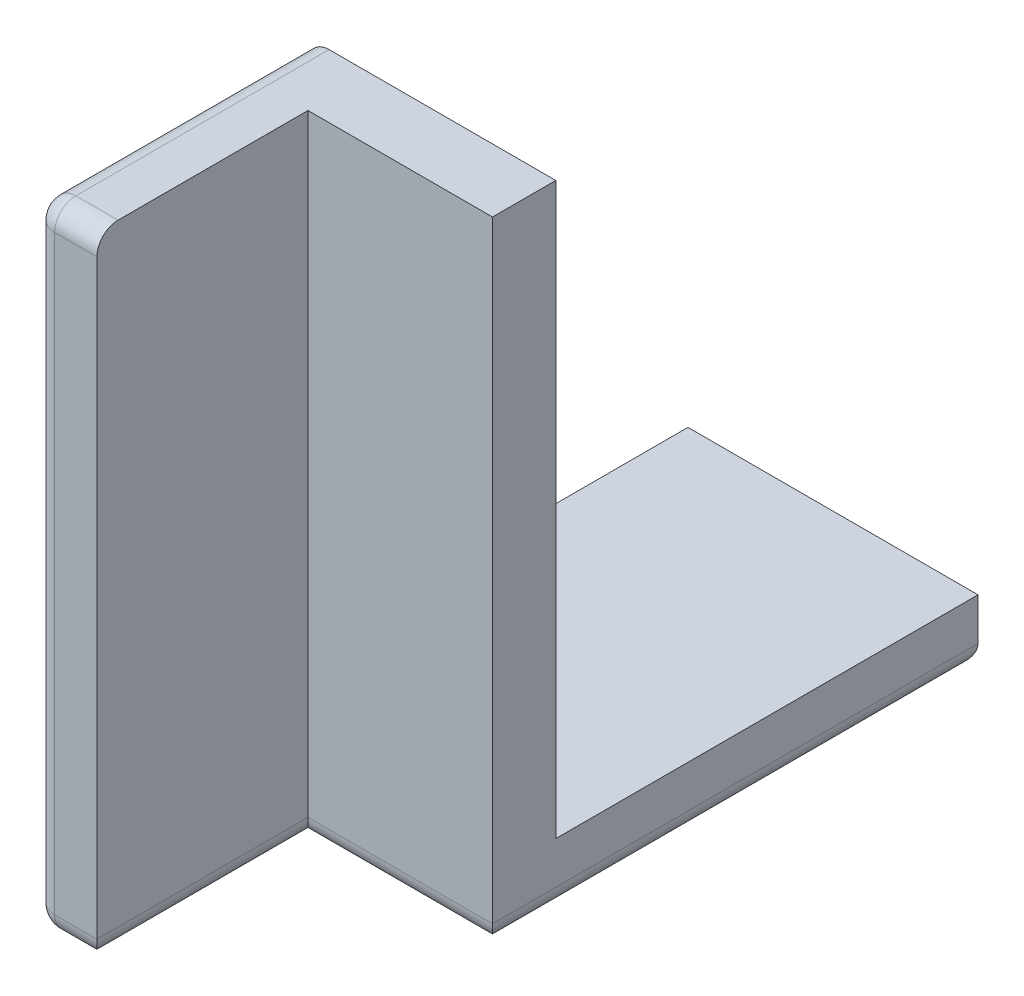
ISO-10303-21;
HEADER;
FILE_DESCRIPTION(('STEP AP214'),'2;1');
FILE_NAME('part.step','',(''),(''),'','','');
FILE_SCHEMA(('AUTOMOTIVE_DESIGN { 1 0 10303 214 1 1 1 1 }'));
ENDSEC;
DATA;
#1=APPLICATION_CONTEXT('core data for automotive mechanical design processes');
#2=APPLICATION_PROTOCOL_DEFINITION('international standard','automotive_design',2000,#1);
#3=PRODUCT_CONTEXT('',#1,'mechanical');
#4=PRODUCT('Part','Part','',(#3));
#5=PRODUCT_RELATED_PRODUCT_CATEGORY('part','',(#4));
#6=PRODUCT_DEFINITION_FORMATION('','',#4);
#7=PRODUCT_DEFINITION_CONTEXT('part definition',#1,'design');
#8=PRODUCT_DEFINITION('design','',#6,#7);
#9=PRODUCT_DEFINITION_SHAPE('','',#8);
#10=(LENGTH_UNIT() NAMED_UNIT(*) SI_UNIT(.MILLI.,.METRE.));
#11=(NAMED_UNIT(*) PLANE_ANGLE_UNIT() SI_UNIT($,.RADIAN.));
#12=(NAMED_UNIT(*) SI_UNIT($,.STERADIAN.) SOLID_ANGLE_UNIT());
#13=UNCERTAINTY_MEASURE_WITH_UNIT(LENGTH_MEASURE(1.E-05),#10,'distance_accuracy_value','');
#14=(GEOMETRIC_REPRESENTATION_CONTEXT(3) GLOBAL_UNCERTAINTY_ASSIGNED_CONTEXT((#13)) GLOBAL_UNIT_ASSIGNED_CONTEXT((#10,
#11,#12)) REPRESENTATION_CONTEXT('',''));
#15=CARTESIAN_POINT('',(0.,0.,0.));
#16=DIRECTION('',(0.,0.,1.));
#17=DIRECTION('',(1.,0.,0.));
#18=AXIS2_PLACEMENT_3D('',#15,#16,#17);
#19=CARTESIAN_POINT('',(0.,0.,0.));
#20=DIRECTION('',(0.,0.,1.));
#21=DIRECTION('',(1.,0.,0.));
#22=AXIS2_PLACEMENT_3D('',#19,#20,#21);
#23=PLANE('',#22);
#24=DIRECTION('',(0.,-1.,0.));
#25=VECTOR('',#24,1.);
#26=CARTESIAN_POINT('',(-3.,0.,0.));
#27=LINE('',#26,#25);
#28=CARTESIAN_POINT('',(-3.,-1.,0.));
#29=VERTEX_POINT('',#28);
#30=CARTESIAN_POINT('',(-3.,-27.,0.));
#31=VERTEX_POINT('',#30);
#32=EDGE_CURVE('E162',#29,#31,#27,.T.);
#33=ORIENTED_EDGE('',*,*,#32,.F.);
#34=CARTESIAN_POINT('',(-2.,-1.,0.));
#35=DIRECTION('',(0.,0.,1.));
#36=DIRECTION('',(1.,0.,0.));
#37=AXIS2_PLACEMENT_3D('',#34,#35,#36);
#38=CIRCLE('',#37,1.);
#39=CARTESIAN_POINT('',(-2.,0.,0.));
#40=VERTEX_POINT('',#39);
#41=EDGE_CURVE('E42',#29,#40,#38,.F.);
#42=ORIENTED_EDGE('',*,*,#41,.T.);
#43=DIRECTION('',(-1.,0.,0.));
#44=VECTOR('',#43,1.);
#45=CARTESIAN_POINT('',(8.74,0.,0.));
#46=LINE('',#45,#44);
#47=CARTESIAN_POINT('',(8.74,0.,0.));
#48=VERTEX_POINT('',#47);
#49=EDGE_CURVE('E182',#48,#40,#46,.T.);
#50=ORIENTED_EDGE('',*,*,#49,.F.);
#51=DIRECTION('',(0.,1.,0.));
#52=VECTOR('',#51,1.);
#53=CARTESIAN_POINT('',(8.74,-30.,0.));
#54=LINE('',#53,#52);
#55=CARTESIAN_POINT('',(8.74,-27.,0.));
#56=VERTEX_POINT('',#55);
#57=EDGE_CURVE('E186',#56,#48,#54,.T.);
#58=ORIENTED_EDGE('',*,*,#57,.F.);
#59=DIRECTION('',(1.,0.,0.));
#60=VECTOR('',#59,1.);
#61=CARTESIAN_POINT('',(0.,-27.,0.));
#62=LINE('',#61,#60);
#63=EDGE_CURVE('E323',#31,#56,#62,.T.);
#64=ORIENTED_EDGE('',*,*,#63,.F.);
#65=EDGE_LOOP('',(#33,#42,#50,#58,#64));
#66=FACE_BOUND('',#65,.T.);
#67=ADVANCED_FACE('F33',(#66),#23,.F.);
#68=CARTESIAN_POINT('',(0.,-30.,3.));
#69=DIRECTION('',(0.,1.,0.));
#70=DIRECTION('',(0.,0.,1.));
#71=AXIS2_PLACEMENT_3D('',#68,#69,#70);
#72=PLANE('',#71);
#73=DIRECTION('',(-1.,0.,0.));
#74=VECTOR('',#73,1.);
#75=CARTESIAN_POINT('',(8.74,-30.,-19.));
#76=LINE('',#75,#74);
#77=CARTESIAN_POINT('',(-4.,-30.,-19.));
#78=VERTEX_POINT('',#77);
#79=CARTESIAN_POINT('',(7.74,-30.,-19.));
#80=VERTEX_POINT('',#79);
#81=EDGE_CURVE('E207',#78,#80,#76,.F.);
#82=ORIENTED_EDGE('',*,*,#81,.T.);
#83=DIRECTION('',(0.,0.,-1.));
#84=VECTOR('',#83,1.);
#85=CARTESIAN_POINT('',(7.74,-30.,3.));
#86=LINE('',#85,#84);
#87=CARTESIAN_POINT('',(7.74,-30.,2.));
#88=VERTEX_POINT('',#87);
#89=EDGE_CURVE('E209',#80,#88,#86,.F.);
#90=ORIENTED_EDGE('',*,*,#89,.T.);
#91=DIRECTION('',(1.,0.,0.));
#92=VECTOR('',#91,1.);
#93=CARTESIAN_POINT('',(0.,-30.,2.));
#94=LINE('',#93,#92);
#95=CARTESIAN_POINT('',(-1.,-30.,2.));
#96=VERTEX_POINT('',#95);
#97=EDGE_CURVE('E195',#88,#96,#94,.F.);
#98=ORIENTED_EDGE('',*,*,#97,.T.);
#99=DIRECTION('',(0.,0.,-1.));
#100=VECTOR('',#99,1.);
#101=CARTESIAN_POINT('',(-1.,-30.,3.));
#102=LINE('',#101,#100);
#103=CARTESIAN_POINT('',(-1.,-30.,12.));
#104=VERTEX_POINT('',#103);
#105=EDGE_CURVE('E197',#96,#104,#102,.F.);
#106=ORIENTED_EDGE('',*,*,#105,.T.);
#107=DIRECTION('',(1.,0.,0.));
#108=VECTOR('',#107,1.);
#109=CARTESIAN_POINT('',(-3.,-30.,12.));
#110=LINE('',#109,#108);
#111=CARTESIAN_POINT('',(-2.,-30.,12.));
#112=VERTEX_POINT('',#111);
#113=EDGE_CURVE('E199',#104,#112,#110,.F.);
#114=ORIENTED_EDGE('',*,*,#113,.T.);
#115=DIRECTION('',(0.,0.,1.));
#116=VECTOR('',#115,1.);
#117=CARTESIAN_POINT('',(-2.,-30.,0.));
#118=LINE('',#117,#116);
#119=CARTESIAN_POINT('',(-2.,-30.,-1.));
#120=VERTEX_POINT('',#119);
#121=EDGE_CURVE('E201',#112,#120,#118,.F.);
#122=ORIENTED_EDGE('',*,*,#121,.T.);
#123=DIRECTION('',(1.,0.,0.));
#124=VECTOR('',#123,1.);
#125=CARTESIAN_POINT('',(0.,-30.,-1.));
#126=LINE('',#125,#124);
#127=CARTESIAN_POINT('',(-4.,-30.,-1.));
#128=VERTEX_POINT('',#127);
#129=EDGE_CURVE('E203',#120,#128,#126,.F.);
#130=ORIENTED_EDGE('',*,*,#129,.T.);
#131=DIRECTION('',(0.,0.,1.));
#132=VECTOR('',#131,1.);
#133=CARTESIAN_POINT('',(-4.,-30.,3.));
#134=LINE('',#133,#132);
#135=EDGE_CURVE('E205',#128,#78,#134,.F.);
#136=ORIENTED_EDGE('',*,*,#135,.T.);
#137=EDGE_LOOP('',(#82,#90,#98,#106,#114,#122,#130,#136));
#138=FACE_BOUND('',#137,.T.);
#139=ADVANCED_FACE('F355',(#138),#72,.F.);
#140=CARTESIAN_POINT('',(8.74,-30.,3.));
#141=DIRECTION('',(-1.,0.,0.));
#142=DIRECTION('',(0.,0.,1.));
#143=AXIS2_PLACEMENT_3D('',#140,#141,#142);
#144=PLANE('',#143);
#145=DIRECTION('',(0.,1.,0.));
#146=VECTOR('',#145,1.);
#147=CARTESIAN_POINT('',(8.74,-30.,3.));
#148=LINE('',#147,#146);
#149=CARTESIAN_POINT('',(8.74,-29.,3.));
#150=VERTEX_POINT('',#149);
#151=CARTESIAN_POINT('',(8.74,0.,3.));
#152=VERTEX_POINT('',#151);
#153=EDGE_CURVE('E176',#150,#152,#148,.T.);
#154=ORIENTED_EDGE('',*,*,#153,.F.);
#155=DIRECTION('',(0.,0.,-1.));
#156=VECTOR('',#155,1.);
#157=CARTESIAN_POINT('',(8.74,-29.,3.));
#158=LINE('',#157,#156);
#159=CARTESIAN_POINT('',(8.74,-29.,-20.));
#160=VERTEX_POINT('',#159);
#161=EDGE_CURVE('E192',#150,#160,#158,.T.);
#162=ORIENTED_EDGE('',*,*,#161,.T.);
#163=DIRECTION('',(0.,-1.,0.));
#164=VECTOR('',#163,1.);
#165=CARTESIAN_POINT('',(8.74,-27.,-20.));
#166=LINE('',#165,#164);
#167=CARTESIAN_POINT('',(8.74,-27.,-20.));
#168=VERTEX_POINT('',#167);
#169=EDGE_CURVE('E332',#168,#160,#166,.T.);
#170=ORIENTED_EDGE('',*,*,#169,.F.);
#171=DIRECTION('',(0.,0.,1.));
#172=VECTOR('',#171,1.);
#173=CARTESIAN_POINT('',(8.74,-27.,-20.));
#174=LINE('',#173,#172);
#175=EDGE_CURVE('E188',#168,#56,#174,.T.);
#176=ORIENTED_EDGE('',*,*,#175,.T.);
#177=ORIENTED_EDGE('',*,*,#57,.T.);
#178=DIRECTION('',(0.,0.,-1.));
#179=VECTOR('',#178,1.);
#180=CARTESIAN_POINT('',(8.74,0.,3.));
#181=LINE('',#180,#179);
#182=EDGE_CURVE('E178',#152,#48,#181,.T.);
#183=ORIENTED_EDGE('',*,*,#182,.F.);
#184=EDGE_LOOP('',(#154,#162,#170,#176,#177,#183));
#185=FACE_BOUND('',#184,.T.);
#186=ADVANCED_FACE('F317',(#185),#144,.F.);
#187=CARTESIAN_POINT('',(8.74,0.,3.));
#188=DIRECTION('',(0.,-1.,0.));
#189=DIRECTION('',(1.,0.,0.));
#190=AXIS2_PLACEMENT_3D('',#187,#188,#189);
#191=PLANE('',#190);
#192=DIRECTION('',(0.,0.,-1.));
#193=VECTOR('',#192,1.);
#194=CARTESIAN_POINT('',(-2.,0.,13.));
#195=LINE('',#194,#193);
#196=CARTESIAN_POINT('',(-2.,0.,12.));
#197=VERTEX_POINT('',#196);
#198=EDGE_CURVE('E50',#40,#197,#195,.F.);
#199=ORIENTED_EDGE('',*,*,#198,.T.);
#200=DIRECTION('',(-1.,0.,0.));
#201=VECTOR('',#200,1.);
#202=CARTESIAN_POINT('',(0.,0.,12.));
#203=LINE('',#202,#201);
#204=CARTESIAN_POINT('',(0.,0.,12.));
#205=VERTEX_POINT('',#204);
#206=EDGE_CURVE('E159',#197,#205,#203,.F.);
#207=ORIENTED_EDGE('',*,*,#206,.T.);
#208=DIRECTION('',(0.,0.,-1.));
#209=VECTOR('',#208,1.);
#210=CARTESIAN_POINT('',(0.,0.,13.));
#211=LINE('',#210,#209);
#212=CARTESIAN_POINT('',(0.,0.,3.));
#213=VERTEX_POINT('',#212);
#214=EDGE_CURVE('E153',#205,#213,#211,.T.);
#215=ORIENTED_EDGE('',*,*,#214,.T.);
#216=DIRECTION('',(-1.,0.,0.));
#217=VECTOR('',#216,1.);
#218=CARTESIAN_POINT('',(8.74,0.,3.));
#219=LINE('',#218,#217);
#220=EDGE_CURVE('E158',#152,#213,#219,.T.);
#221=ORIENTED_EDGE('',*,*,#220,.F.);
#222=ORIENTED_EDGE('',*,*,#182,.T.);
#223=ORIENTED_EDGE('',*,*,#49,.T.);
#224=EDGE_LOOP('',(#199,#207,#215,#221,#222,#223));
#225=FACE_BOUND('',#224,.T.);
#226=ADVANCED_FACE('F155',(#225),#191,.F.);
#227=CARTESIAN_POINT('',(0.,0.,3.));
#228=DIRECTION('',(0.,0.,1.));
#229=DIRECTION('',(1.,0.,0.));
#230=AXIS2_PLACEMENT_3D('',#227,#228,#229);
#231=PLANE('',#230);
#232=DIRECTION('',(0.,1.,0.));
#233=VECTOR('',#232,1.);
#234=CARTESIAN_POINT('',(0.,-30.,3.));
#235=LINE('',#234,#233);
#236=CARTESIAN_POINT('',(0.,-29.,3.));
#237=VERTEX_POINT('',#236);
#238=EDGE_CURVE('E166',#237,#213,#235,.T.);
#239=ORIENTED_EDGE('',*,*,#238,.F.);
#240=DIRECTION('',(1.,0.,0.));
#241=VECTOR('',#240,1.);
#242=CARTESIAN_POINT('',(8.74,-29.,3.));
#243=LINE('',#242,#241);
#244=EDGE_CURVE('E237',#237,#150,#243,.T.);
#245=ORIENTED_EDGE('',*,*,#244,.T.);
#246=ORIENTED_EDGE('',*,*,#153,.T.);
#247=ORIENTED_EDGE('',*,*,#220,.T.);
#248=EDGE_LOOP('',(#239,#245,#246,#247));
#249=FACE_BOUND('',#248,.T.);
#250=ADVANCED_FACE('F174',(#249),#231,.T.);
#251=CARTESIAN_POINT('',(0.,-27.,-20.));
#252=DIRECTION('',(0.,-1.,0.));
#253=DIRECTION('',(0.,0.,-1.));
#254=AXIS2_PLACEMENT_3D('',#251,#252,#253);
#255=PLANE('',#254);
#256=DIRECTION('',(0.,0.,-1.));
#257=VECTOR('',#256,1.);
#258=CARTESIAN_POINT('',(-5.,-27.,-20.));
#259=LINE('',#258,#257);
#260=CARTESIAN_POINT('',(-5.,-27.,-1.));
#261=VERTEX_POINT('',#260);
#262=CARTESIAN_POINT('',(-5.,-27.,-20.));
#263=VERTEX_POINT('',#262);
#264=EDGE_CURVE('E339',#261,#263,#259,.T.);
#265=ORIENTED_EDGE('',*,*,#264,.F.);
#266=CARTESIAN_POINT('',(-4.,-27.,-1.));
#267=DIRECTION('',(0.,-1.,0.));
#268=DIRECTION('',(0.,0.,-1.));
#269=AXIS2_PLACEMENT_3D('',#266,#267,#268);
#270=CIRCLE('',#269,1.);
#271=CARTESIAN_POINT('',(-4.,-27.,0.));
#272=VERTEX_POINT('',#271);
#273=EDGE_CURVE('E11',#261,#272,#270,.F.);
#274=ORIENTED_EDGE('',*,*,#273,.T.);
#275=DIRECTION('',(1.,0.,0.));
#276=VECTOR('',#275,1.);
#277=CARTESIAN_POINT('',(-5.,-27.,0.));
#278=LINE('',#277,#276);
#279=EDGE_CURVE('E331',#272,#31,#278,.T.);
#280=ORIENTED_EDGE('',*,*,#279,.T.);
#281=ORIENTED_EDGE('',*,*,#63,.T.);
#282=ORIENTED_EDGE('',*,*,#175,.F.);
#283=DIRECTION('',(1.,0.,0.));
#284=VECTOR('',#283,1.);
#285=CARTESIAN_POINT('',(0.,-27.,-20.));
#286=LINE('',#285,#284);
#287=EDGE_CURVE('E334',#263,#168,#286,.T.);
#288=ORIENTED_EDGE('',*,*,#287,.F.);
#289=EDGE_LOOP('',(#265,#274,#280,#281,#282,#288));
#290=FACE_BOUND('',#289,.T.);
#291=ADVANCED_FACE('F328',(#290),#255,.F.);
#292=CARTESIAN_POINT('',(0.,0.,-20.));
#293=DIRECTION('',(0.,0.,-1.));
#294=DIRECTION('',(-1.,0.,0.));
#295=AXIS2_PLACEMENT_3D('',#292,#293,#294);
#296=PLANE('',#295);
#297=ORIENTED_EDGE('',*,*,#169,.T.);
#298=DIRECTION('',(-1.,0.,0.));
#299=VECTOR('',#298,1.);
#300=CARTESIAN_POINT('',(-5.,-29.,-20.));
#301=LINE('',#300,#299);
#302=CARTESIAN_POINT('',(-5.,-29.,-20.));
#303=VERTEX_POINT('',#302);
#304=EDGE_CURVE('E212',#160,#303,#301,.T.);
#305=ORIENTED_EDGE('',*,*,#304,.T.);
#306=DIRECTION('',(0.,-1.,0.));
#307=VECTOR('',#306,1.);
#308=CARTESIAN_POINT('',(-5.,-30.,-20.));
#309=LINE('',#308,#307);
#310=EDGE_CURVE('E341',#263,#303,#309,.T.);
#311=ORIENTED_EDGE('',*,*,#310,.F.);
#312=ORIENTED_EDGE('',*,*,#287,.T.);
#313=EDGE_LOOP('',(#297,#305,#311,#312));
#314=FACE_BOUND('',#313,.T.);
#315=ADVANCED_FACE('F562',(#314),#296,.T.);
#316=CARTESIAN_POINT('',(-5.,-27.,0.));
#317=DIRECTION('',(0.,0.,-1.));
#318=DIRECTION('',(-1.,0.,0.));
#319=AXIS2_PLACEMENT_3D('',#316,#317,#318);
#320=PLANE('',#319);
#321=DIRECTION('',(0.,1.,0.));
#322=VECTOR('',#321,1.);
#323=CARTESIAN_POINT('',(-4.,-27.,0.));
#324=LINE('',#323,#322);
#325=CARTESIAN_POINT('',(-4.,-29.,0.));
#326=VERTEX_POINT('',#325);
#327=EDGE_CURVE('E218',#272,#326,#324,.F.);
#328=ORIENTED_EDGE('',*,*,#327,.T.);
#329=DIRECTION('',(1.,0.,0.));
#330=VECTOR('',#329,1.);
#331=CARTESIAN_POINT('',(-5.,-29.,0.));
#332=LINE('',#331,#330);
#333=CARTESIAN_POINT('',(-3.,-29.,0.));
#334=VERTEX_POINT('',#333);
#335=EDGE_CURVE('E220',#326,#334,#332,.T.);
#336=ORIENTED_EDGE('',*,*,#335,.T.);
#337=DIRECTION('',(0.,1.,0.));
#338=VECTOR('',#337,1.);
#339=CARTESIAN_POINT('',(-3.,-27.,0.));
#340=LINE('',#339,#338);
#341=EDGE_CURVE('E180',#334,#31,#340,.T.);
#342=ORIENTED_EDGE('',*,*,#341,.T.);
#343=ORIENTED_EDGE('',*,*,#279,.F.);
#344=EDGE_LOOP('',(#328,#336,#342,#343));
#345=FACE_BOUND('',#344,.T.);
#346=ADVANCED_FACE('F568',(#345),#320,.F.);
#347=CARTESIAN_POINT('',(-5.,0.,0.));
#348=DIRECTION('',(1.,0.,0.));
#349=DIRECTION('',(0.,1.,0.));
#350=AXIS2_PLACEMENT_3D('',#347,#348,#349);
#351=PLANE('',#350);
#352=ORIENTED_EDGE('',*,*,#310,.T.);
#353=DIRECTION('',(0.,0.,1.));
#354=VECTOR('',#353,1.);
#355=CARTESIAN_POINT('',(-5.,-29.,0.));
#356=LINE('',#355,#354);
#357=CARTESIAN_POINT('',(-5.,-29.,-1.));
#358=VERTEX_POINT('',#357);
#359=EDGE_CURVE('E216',#303,#358,#356,.T.);
#360=ORIENTED_EDGE('',*,*,#359,.T.);
#361=DIRECTION('',(0.,1.,0.));
#362=VECTOR('',#361,1.);
#363=CARTESIAN_POINT('',(-5.,0.,-1.));
#364=LINE('',#363,#362);
#365=EDGE_CURVE('E214',#358,#261,#364,.T.);
#366=ORIENTED_EDGE('',*,*,#365,.T.);
#367=ORIENTED_EDGE('',*,*,#264,.T.);
#368=EDGE_LOOP('',(#352,#360,#366,#367));
#369=FACE_BOUND('',#368,.T.);
#370=ADVANCED_FACE('F517',(#369),#351,.F.);
#371=CARTESIAN_POINT('',(-3.,0.,0.));
#372=DIRECTION('',(-1.,0.,0.));
#373=DIRECTION('',(0.,-1.,0.));
#374=AXIS2_PLACEMENT_3D('',#371,#372,#373);
#375=PLANE('',#374);
#376=ORIENTED_EDGE('',*,*,#341,.F.);
#377=DIRECTION('',(0.,0.,1.));
#378=VECTOR('',#377,1.);
#379=CARTESIAN_POINT('',(-3.,-29.,13.));
#380=LINE('',#379,#378);
#381=CARTESIAN_POINT('',(-3.,-29.,12.));
#382=VERTEX_POINT('',#381);
#383=EDGE_CURVE('E226',#334,#382,#380,.T.);
#384=ORIENTED_EDGE('',*,*,#383,.T.);
#385=DIRECTION('',(0.,-1.,0.));
#386=VECTOR('',#385,1.);
#387=CARTESIAN_POINT('',(-3.,0.,12.));
#388=LINE('',#387,#386);
#389=CARTESIAN_POINT('',(-3.,-1.,12.));
#390=VERTEX_POINT('',#389);
#391=EDGE_CURVE('E222',#382,#390,#388,.F.);
#392=ORIENTED_EDGE('',*,*,#391,.T.);
#393=DIRECTION('',(0.,0.,-1.));
#394=VECTOR('',#393,1.);
#395=CARTESIAN_POINT('',(-3.,-1.,0.));
#396=LINE('',#395,#394);
#397=EDGE_CURVE('E224',#390,#29,#396,.T.);
#398=ORIENTED_EDGE('',*,*,#397,.T.);
#399=ORIENTED_EDGE('',*,*,#32,.T.);
#400=EDGE_LOOP('',(#376,#384,#392,#398,#399));
#401=FACE_BOUND('',#400,.T.);
#402=ADVANCED_FACE('F346',(#401),#375,.T.);
#403=CARTESIAN_POINT('',(0.,-30.,13.));
#404=DIRECTION('',(-1.,0.,0.));
#405=DIRECTION('',(0.,0.,1.));
#406=AXIS2_PLACEMENT_3D('',#403,#404,#405);
#407=PLANE('',#406);
#408=DIRECTION('',(0.,1.,0.));
#409=VECTOR('',#408,1.);
#410=CARTESIAN_POINT('',(0.,-30.,13.));
#411=LINE('',#410,#409);
#412=CARTESIAN_POINT('',(0.,-29.,13.));
#413=VERTEX_POINT('',#412);
#414=CARTESIAN_POINT('',(0.,-1.,13.));
#415=VERTEX_POINT('',#414);
#416=EDGE_CURVE('E163',#413,#415,#411,.T.);
#417=ORIENTED_EDGE('',*,*,#416,.F.);
#418=DIRECTION('',(0.,0.,-1.));
#419=VECTOR('',#418,1.);
#420=CARTESIAN_POINT('',(0.,-29.,13.));
#421=LINE('',#420,#419);
#422=EDGE_CURVE('E170',#413,#237,#421,.T.);
#423=ORIENTED_EDGE('',*,*,#422,.T.);
#424=ORIENTED_EDGE('',*,*,#238,.T.);
#425=ORIENTED_EDGE('',*,*,#214,.F.);
#426=CARTESIAN_POINT('',(0.,-1.,12.));
#427=DIRECTION('',(-1.,0.,0.));
#428=DIRECTION('',(0.,0.,1.));
#429=AXIS2_PLACEMENT_3D('',#426,#427,#428);
#430=CIRCLE('',#429,1.);
#431=EDGE_CURVE('E234',#205,#415,#430,.F.);
#432=ORIENTED_EDGE('',*,*,#431,.T.);
#433=EDGE_LOOP('',(#417,#423,#424,#425,#432));
#434=FACE_BOUND('',#433,.T.);
#435=ADVANCED_FACE('F168',(#434),#407,.F.);
#436=CARTESIAN_POINT('',(0.,0.,13.));
#437=DIRECTION('',(0.,0.,1.));
#438=DIRECTION('',(1.,0.,0.));
#439=AXIS2_PLACEMENT_3D('',#436,#437,#438);
#440=PLANE('',#439);
#441=DIRECTION('',(0.,-1.,0.));
#442=VECTOR('',#441,1.);
#443=CARTESIAN_POINT('',(-2.,0.,13.));
#444=LINE('',#443,#442);
#445=CARTESIAN_POINT('',(-2.,-1.,13.));
#446=VERTEX_POINT('',#445);
#447=CARTESIAN_POINT('',(-2.,-29.,13.));
#448=VERTEX_POINT('',#447);
#449=EDGE_CURVE('E228',#446,#448,#444,.T.);
#450=ORIENTED_EDGE('',*,*,#449,.T.);
#451=DIRECTION('',(1.,0.,0.));
#452=VECTOR('',#451,1.);
#453=CARTESIAN_POINT('',(0.,-29.,13.));
#454=LINE('',#453,#452);
#455=EDGE_CURVE('E232',#448,#413,#454,.T.);
#456=ORIENTED_EDGE('',*,*,#455,.T.);
#457=ORIENTED_EDGE('',*,*,#416,.T.);
#458=DIRECTION('',(-1.,0.,0.));
#459=VECTOR('',#458,1.);
#460=CARTESIAN_POINT('',(-3.,-1.,13.));
#461=LINE('',#460,#459);
#462=EDGE_CURVE('E230',#415,#446,#461,.T.);
#463=ORIENTED_EDGE('',*,*,#462,.T.);
#464=EDGE_LOOP('',(#450,#456,#457,#463));
#465=FACE_BOUND('',#464,.T.);
#466=ADVANCED_FACE('F296',(#465),#440,.T.);
#467=CARTESIAN_POINT('',(-2.,-1.,0.));
#468=DIRECTION('',(0.,0.,1.));
#469=DIRECTION('',(1.,0.,0.));
#470=AXIS2_PLACEMENT_3D('',#467,#468,#469);
#471=CYLINDRICAL_SURFACE('',#470,1.);
#472=ORIENTED_EDGE('',*,*,#41,.F.);
#473=ORIENTED_EDGE('',*,*,#397,.F.);
#474=CARTESIAN_POINT('',(-2.,-1.,12.));
#475=DIRECTION('',(0.,0.,1.));
#476=DIRECTION('',(1.,0.,0.));
#477=AXIS2_PLACEMENT_3D('',#474,#475,#476);
#478=CIRCLE('',#477,1.);
#479=EDGE_CURVE('E37',#197,#390,#478,.T.);
#480=ORIENTED_EDGE('',*,*,#479,.F.);
#481=ORIENTED_EDGE('',*,*,#198,.F.);
#482=EDGE_LOOP('',(#472,#473,#480,#481));
#483=FACE_BOUND('',#482,.T.);
#484=ADVANCED_FACE('F35',(#483),#471,.T.);
#485=CARTESIAN_POINT('',(0.,-1.,12.));
#486=DIRECTION('',(1.,0.,0.));
#487=DIRECTION('',(0.,1.,0.));
#488=AXIS2_PLACEMENT_3D('',#485,#486,#487);
#489=CYLINDRICAL_SURFACE('',#488,1.);
#490=ORIENTED_EDGE('',*,*,#431,.F.);
#491=ORIENTED_EDGE('',*,*,#206,.F.);
#492=CARTESIAN_POINT('',(-2.,-1.,12.));
#493=DIRECTION('',(-1.,0.,0.));
#494=DIRECTION('',(0.,0.,1.));
#495=AXIS2_PLACEMENT_3D('',#492,#493,#494);
#496=CIRCLE('',#495,1.);
#497=EDGE_CURVE('E278',#446,#197,#496,.T.);
#498=ORIENTED_EDGE('',*,*,#497,.F.);
#499=ORIENTED_EDGE('',*,*,#462,.F.);
#500=EDGE_LOOP('',(#490,#491,#498,#499));
#501=FACE_BOUND('',#500,.T.);
#502=ADVANCED_FACE('F301',(#501),#489,.T.);
#503=CARTESIAN_POINT('',(-2.,-1.,12.));
#504=DIRECTION('',(0.,0.,1.));
#505=DIRECTION('',(1.,0.,0.));
#506=AXIS2_PLACEMENT_3D('',#503,#504,#505);
#507=SPHERICAL_SURFACE('',#506,1.);
#508=ORIENTED_EDGE('',*,*,#497,.T.);
#509=ORIENTED_EDGE('',*,*,#479,.T.);
#510=CARTESIAN_POINT('',(-2.,-1.,12.));
#511=DIRECTION('',(0.,1.,0.));
#512=DIRECTION('',(-1.,0.,0.));
#513=AXIS2_PLACEMENT_3D('',#510,#511,#512);
#514=CIRCLE('',#513,1.);
#515=EDGE_CURVE('E276',#446,#390,#514,.F.);
#516=ORIENTED_EDGE('',*,*,#515,.F.);
#517=EDGE_LOOP('',(#508,#509,#516));
#518=FACE_BOUND('',#517,.T.);
#519=ADVANCED_FACE('F285',(#518),#507,.T.);
#520=CARTESIAN_POINT('',(-2.,0.,12.));
#521=DIRECTION('',(0.,-1.,0.));
#522=DIRECTION('',(1.,0.,0.));
#523=AXIS2_PLACEMENT_3D('',#520,#521,#522);
#524=CYLINDRICAL_SURFACE('',#523,1.);
#525=ORIENTED_EDGE('',*,*,#515,.T.);
#526=ORIENTED_EDGE('',*,*,#391,.F.);
#527=CARTESIAN_POINT('',(-2.,-29.,12.));
#528=DIRECTION('',(0.,-1.,0.));
#529=DIRECTION('',(0.,0.,-1.));
#530=AXIS2_PLACEMENT_3D('',#527,#528,#529);
#531=CIRCLE('',#530,1.);
#532=EDGE_CURVE('E270',#448,#382,#531,.T.);
#533=ORIENTED_EDGE('',*,*,#532,.F.);
#534=ORIENTED_EDGE('',*,*,#449,.F.);
#535=EDGE_LOOP('',(#525,#526,#533,#534));
#536=FACE_BOUND('',#535,.T.);
#537=ADVANCED_FACE('F291',(#536),#524,.T.);
#538=CARTESIAN_POINT('',(-2.,-29.,0.));
#539=DIRECTION('',(0.,0.,-1.));
#540=DIRECTION('',(-1.,0.,0.));
#541=AXIS2_PLACEMENT_3D('',#538,#539,#540);
#542=CYLINDRICAL_SURFACE('',#541,1.);
#543=CARTESIAN_POINT('',(-2.,-29.,12.));
#544=DIRECTION('',(0.,0.,1.));
#545=DIRECTION('',(1.,0.,0.));
#546=AXIS2_PLACEMENT_3D('',#543,#544,#545);
#547=CIRCLE('',#546,1.);
#548=EDGE_CURVE('E273',#382,#112,#547,.T.);
#549=ORIENTED_EDGE('',*,*,#548,.F.);
#550=ORIENTED_EDGE('',*,*,#383,.F.);
#551=CARTESIAN_POINT('',(-2.,-29.,-1.));
#552=DIRECTION('',(0.707106781186547,0.,0.707106781186547));
#553=DIRECTION('',(0.707106781186547,0.,-0.707106781186547));
#554=AXIS2_PLACEMENT_3D('',#551,#552,#553);
#555=ELLIPSE('',#554,1.41421356237309,1.);
#556=EDGE_CURVE('E267',#120,#334,#555,.F.);
#557=ORIENTED_EDGE('',*,*,#556,.F.);
#558=ORIENTED_EDGE('',*,*,#121,.F.);
#559=EDGE_LOOP('',(#549,#550,#557,#558));
#560=FACE_BOUND('',#559,.T.);
#561=ADVANCED_FACE('F402',(#560),#542,.T.);
#562=CARTESIAN_POINT('',(-2.,-29.,12.));
#563=DIRECTION('',(0.,0.,1.));
#564=DIRECTION('',(1.,0.,0.));
#565=AXIS2_PLACEMENT_3D('',#562,#563,#564);
#566=SPHERICAL_SURFACE('',#565,1.);
#567=ORIENTED_EDGE('',*,*,#532,.T.);
#568=ORIENTED_EDGE('',*,*,#548,.T.);
#569=CARTESIAN_POINT('',(-2.,-29.,12.));
#570=DIRECTION('',(-1.,0.,0.));
#571=DIRECTION('',(0.,0.,1.));
#572=AXIS2_PLACEMENT_3D('',#569,#570,#571);
#573=CIRCLE('',#572,1.);
#574=EDGE_CURVE('E264',#448,#112,#573,.F.);
#575=ORIENTED_EDGE('',*,*,#574,.F.);
#576=EDGE_LOOP('',(#567,#568,#575));
#577=FACE_BOUND('',#576,.T.);
#578=ADVANCED_FACE('F398',(#577),#566,.T.);
#579=CARTESIAN_POINT('',(-4.,0.,-1.));
#580=DIRECTION('',(0.,1.,0.));
#581=DIRECTION('',(-1.,0.,0.));
#582=AXIS2_PLACEMENT_3D('',#579,#580,#581);
#583=CYLINDRICAL_SURFACE('',#582,1.);
#584=ORIENTED_EDGE('',*,*,#273,.F.);
#585=ORIENTED_EDGE('',*,*,#365,.F.);
#586=CARTESIAN_POINT('',(-4.,-29.,-1.));
#587=DIRECTION('',(0.,-1.,0.));
#588=DIRECTION('',(0.,0.,-1.));
#589=AXIS2_PLACEMENT_3D('',#586,#587,#588);
#590=CIRCLE('',#589,1.);
#591=EDGE_CURVE('E261',#326,#358,#590,.T.);
#592=ORIENTED_EDGE('',*,*,#591,.F.);
#593=ORIENTED_EDGE('',*,*,#327,.F.);
#594=EDGE_LOOP('',(#584,#585,#592,#593));
#595=FACE_BOUND('',#594,.T.);
#596=ADVANCED_FACE('F394',(#595),#583,.T.);
#597=CARTESIAN_POINT('',(-5.,-29.,-1.));
#598=DIRECTION('',(1.,0.,0.));
#599=DIRECTION('',(0.,0.,-1.));
#600=AXIS2_PLACEMENT_3D('',#597,#598,#599);
#601=CYLINDRICAL_SURFACE('',#600,1.);
#602=ORIENTED_EDGE('',*,*,#556,.T.);
#603=ORIENTED_EDGE('',*,*,#335,.F.);
#604=CARTESIAN_POINT('',(-4.,-29.,-1.));
#605=DIRECTION('',(-1.,0.,0.));
#606=DIRECTION('',(0.,0.,1.));
#607=AXIS2_PLACEMENT_3D('',#604,#605,#606);
#608=CIRCLE('',#607,1.);
#609=EDGE_CURVE('E258',#128,#326,#608,.T.);
#610=ORIENTED_EDGE('',*,*,#609,.F.);
#611=ORIENTED_EDGE('',*,*,#129,.F.);
#612=EDGE_LOOP('',(#602,#603,#610,#611));
#613=FACE_BOUND('',#612,.T.);
#614=ADVANCED_FACE('F391',(#613),#601,.T.);
#615=CARTESIAN_POINT('',(0.,-29.,12.));
#616=DIRECTION('',(-1.,0.,0.));
#617=DIRECTION('',(0.,0.,1.));
#618=AXIS2_PLACEMENT_3D('',#615,#616,#617);
#619=CYLINDRICAL_SURFACE('',#618,1.);
#620=ORIENTED_EDGE('',*,*,#574,.T.);
#621=ORIENTED_EDGE('',*,*,#113,.F.);
#622=CARTESIAN_POINT('',(-1.,-29.,12.));
#623=DIRECTION('',(0.707106781186547,0.,-0.707106781186547));
#624=DIRECTION('',(-0.707106781186547,0.,-0.707106781186547));
#625=AXIS2_PLACEMENT_3D('',#622,#623,#624);
#626=ELLIPSE('',#625,1.41421356237309,1.);
#627=EDGE_CURVE('E255',#413,#104,#626,.T.);
#628=ORIENTED_EDGE('',*,*,#627,.F.);
#629=ORIENTED_EDGE('',*,*,#455,.F.);
#630=EDGE_LOOP('',(#620,#621,#628,#629));
#631=FACE_BOUND('',#630,.T.);
#632=ADVANCED_FACE('F306',(#631),#619,.T.);
#633=CARTESIAN_POINT('',(-4.,-29.,-1.));
#634=DIRECTION('',(0.,0.,1.));
#635=DIRECTION('',(1.,0.,0.));
#636=AXIS2_PLACEMENT_3D('',#633,#634,#635);
#637=SPHERICAL_SURFACE('',#636,1.);
#638=ORIENTED_EDGE('',*,*,#609,.T.);
#639=ORIENTED_EDGE('',*,*,#591,.T.);
#640=CARTESIAN_POINT('',(-4.,-29.,-1.));
#641=DIRECTION('',(0.,0.,1.));
#642=DIRECTION('',(1.,0.,0.));
#643=AXIS2_PLACEMENT_3D('',#640,#641,#642);
#644=CIRCLE('',#643,1.);
#645=EDGE_CURVE('E252',#128,#358,#644,.F.);
#646=ORIENTED_EDGE('',*,*,#645,.F.);
#647=EDGE_LOOP('',(#638,#639,#646));
#648=FACE_BOUND('',#647,.T.);
#649=ADVANCED_FACE('F385',(#648),#637,.T.);
#650=CARTESIAN_POINT('',(-1.,-29.,13.));
#651=DIRECTION('',(0.,0.,-1.));
#652=DIRECTION('',(-1.,0.,0.));
#653=AXIS2_PLACEMENT_3D('',#650,#651,#652);
#654=CYLINDRICAL_SURFACE('',#653,1.);
#655=ORIENTED_EDGE('',*,*,#627,.T.);
#656=ORIENTED_EDGE('',*,*,#105,.F.);
#657=CARTESIAN_POINT('',(-1.,-29.,2.));
#658=DIRECTION('',(0.707106781186547,0.,-0.707106781186547));
#659=DIRECTION('',(-0.707106781186547,0.,-0.707106781186547));
#660=AXIS2_PLACEMENT_3D('',#657,#658,#659);
#661=ELLIPSE('',#660,1.41421356237309,1.);
#662=EDGE_CURVE('E249',#237,#96,#661,.T.);
#663=ORIENTED_EDGE('',*,*,#662,.F.);
#664=ORIENTED_EDGE('',*,*,#422,.F.);
#665=EDGE_LOOP('',(#655,#656,#663,#664));
#666=FACE_BOUND('',#665,.T.);
#667=ADVANCED_FACE('F309',(#666),#654,.T.);
#668=CARTESIAN_POINT('',(-4.,-29.,0.));
#669=DIRECTION('',(0.,0.,1.));
#670=DIRECTION('',(1.,0.,0.));
#671=AXIS2_PLACEMENT_3D('',#668,#669,#670);
#672=CYLINDRICAL_SURFACE('',#671,1.);
#673=ORIENTED_EDGE('',*,*,#645,.T.);
#674=ORIENTED_EDGE('',*,*,#359,.F.);
#675=CARTESIAN_POINT('',(-4.,-29.,-19.));
#676=DIRECTION('',(-0.707106781186547,0.,0.707106781186547));
#677=DIRECTION('',(0.707106781186547,0.,0.707106781186547));
#678=AXIS2_PLACEMENT_3D('',#675,#676,#677);
#679=ELLIPSE('',#678,1.41421356237309,1.);
#680=EDGE_CURVE('E246',#78,#303,#679,.F.);
#681=ORIENTED_EDGE('',*,*,#680,.F.);
#682=ORIENTED_EDGE('',*,*,#135,.F.);
#683=EDGE_LOOP('',(#673,#674,#681,#682));
#684=FACE_BOUND('',#683,.T.);
#685=ADVANCED_FACE('F379',(#684),#672,.T.);
#686=CARTESIAN_POINT('',(0.,-29.,2.));
#687=DIRECTION('',(-1.,0.,0.));
#688=DIRECTION('',(0.,0.,1.));
#689=AXIS2_PLACEMENT_3D('',#686,#687,#688);
#690=CYLINDRICAL_SURFACE('',#689,1.);
#691=ORIENTED_EDGE('',*,*,#662,.T.);
#692=ORIENTED_EDGE('',*,*,#97,.F.);
#693=CARTESIAN_POINT('',(7.74,-29.,2.));
#694=DIRECTION('',(-0.707106781186547,0.,0.707106781186547));
#695=DIRECTION('',(-0.707106781186547,0.,-0.707106781186547));
#696=AXIS2_PLACEMENT_3D('',#693,#694,#695);
#697=ELLIPSE('',#696,1.41421356237309,1.);
#698=EDGE_CURVE('E244',#150,#88,#697,.F.);
#699=ORIENTED_EDGE('',*,*,#698,.F.);
#700=ORIENTED_EDGE('',*,*,#244,.F.);
#701=EDGE_LOOP('',(#691,#692,#699,#700));
#702=FACE_BOUND('',#701,.T.);
#703=ADVANCED_FACE('F314',(#702),#690,.T.);
#704=CARTESIAN_POINT('',(0.,-29.,-19.));
#705=DIRECTION('',(1.,0.,0.));
#706=DIRECTION('',(0.,0.,-1.));
#707=AXIS2_PLACEMENT_3D('',#704,#705,#706);
#708=CYLINDRICAL_SURFACE('',#707,1.);
#709=ORIENTED_EDGE('',*,*,#680,.T.);
#710=ORIENTED_EDGE('',*,*,#304,.F.);
#711=CARTESIAN_POINT('',(7.74,-29.,-19.));
#712=DIRECTION('',(0.707106781186547,0.,0.707106781186547));
#713=DIRECTION('',(0.707106781186547,0.,-0.707106781186547));
#714=AXIS2_PLACEMENT_3D('',#711,#712,#713);
#715=ELLIPSE('',#714,1.41421356237309,1.);
#716=EDGE_CURVE('E242',#80,#160,#715,.T.);
#717=ORIENTED_EDGE('',*,*,#716,.F.);
#718=ORIENTED_EDGE('',*,*,#81,.F.);
#719=EDGE_LOOP('',(#709,#710,#717,#718));
#720=FACE_BOUND('',#719,.T.);
#721=ADVANCED_FACE('F372',(#720),#708,.T.);
#722=CARTESIAN_POINT('',(7.74,-29.,3.));
#723=DIRECTION('',(0.,0.,-1.));
#724=DIRECTION('',(-1.,0.,0.));
#725=AXIS2_PLACEMENT_3D('',#722,#723,#724);
#726=CYLINDRICAL_SURFACE('',#725,1.);
#727=ORIENTED_EDGE('',*,*,#698,.T.);
#728=ORIENTED_EDGE('',*,*,#89,.F.);
#729=ORIENTED_EDGE('',*,*,#716,.T.);
#730=ORIENTED_EDGE('',*,*,#161,.F.);
#731=EDGE_LOOP('',(#727,#728,#729,#730));
#732=FACE_BOUND('',#731,.T.);
#733=ADVANCED_FACE('F369',(#732),#726,.T.);
#734=CLOSED_SHELL('',(#67,#139,#186,#226,#250,#291,#315,#346,#370,#402,#435,#466,#484,#502,#519,
#537,#561,#578,#596,#614,#632,#649,#667,#685,#703,#721,#733));
#735=MANIFOLD_SOLID_BREP('B2',#734);
#736=ADVANCED_BREP_SHAPE_REPRESENTATION('',(#18,#735),#14);
#737=SHAPE_DEFINITION_REPRESENTATION(#9,#736);
ENDSEC;
END-ISO-10303-21;
